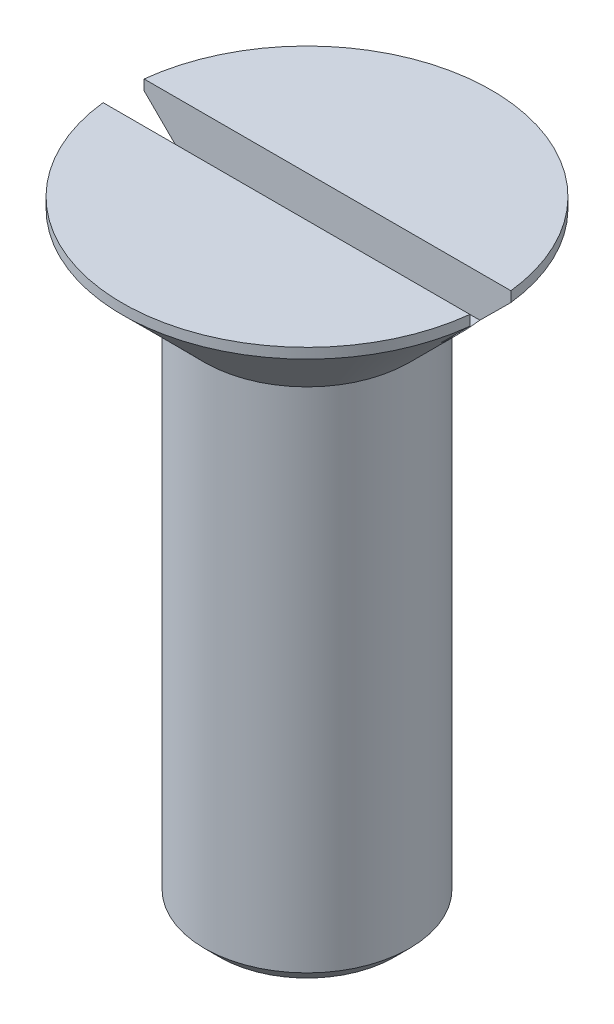
ISO-10303-21;
HEADER;
FILE_DESCRIPTION(('STEP AP214'),'2;1');
FILE_NAME('part.step','',(''),(''),'','','');
FILE_SCHEMA(('AUTOMOTIVE_DESIGN { 1 0 10303 214 1 1 1 1 }'));
ENDSEC;
DATA;
#1=APPLICATION_CONTEXT('core data for automotive mechanical design processes');
#2=APPLICATION_PROTOCOL_DEFINITION('international standard','automotive_design',2000,#1);
#3=PRODUCT_CONTEXT('',#1,'mechanical');
#4=PRODUCT('Part','Part','',(#3));
#5=PRODUCT_RELATED_PRODUCT_CATEGORY('part','',(#4));
#6=PRODUCT_DEFINITION_FORMATION('','',#4);
#7=PRODUCT_DEFINITION_CONTEXT('part definition',#1,'design');
#8=PRODUCT_DEFINITION('design','',#6,#7);
#9=PRODUCT_DEFINITION_SHAPE('','',#8);
#10=(LENGTH_UNIT() NAMED_UNIT(*) SI_UNIT(.MILLI.,.METRE.));
#11=(NAMED_UNIT(*) PLANE_ANGLE_UNIT() SI_UNIT($,.RADIAN.));
#12=(NAMED_UNIT(*) SI_UNIT($,.STERADIAN.) SOLID_ANGLE_UNIT());
#13=UNCERTAINTY_MEASURE_WITH_UNIT(LENGTH_MEASURE(1.E-05),#10,'distance_accuracy_value','');
#14=(GEOMETRIC_REPRESENTATION_CONTEXT(3) GLOBAL_UNCERTAINTY_ASSIGNED_CONTEXT((#13)) GLOBAL_UNIT_ASSIGNED_CONTEXT((#10,
#11,#12)) REPRESENTATION_CONTEXT('',''));
#15=CARTESIAN_POINT('',(0.,0.,0.));
#16=DIRECTION('',(0.,0.,1.));
#17=DIRECTION('',(1.,0.,0.));
#18=AXIS2_PLACEMENT_3D('',#15,#16,#17);
#19=CARTESIAN_POINT('',(0.,125.763182897862,0.));
#20=DIRECTION('',(0.,1.,0.));
#21=DIRECTION('',(-1.,0.,0.));
#22=AXIS2_PLACEMENT_3D('',#19,#20,#21);
#23=CYLINDRICAL_SURFACE('',#22,9.00000000000001);
#24=CARTESIAN_POINT('',(0.,29.5,0.));
#25=DIRECTION('',(0.,1.,0.));
#26=DIRECTION('',(-1.,0.,0.));
#27=AXIS2_PLACEMENT_3D('',#24,#25,#26);
#28=CIRCLE('',#27,9.00000000000001);
#29=CARTESIAN_POINT('',(8.94427190999917,29.5,-1.));
#30=VERTEX_POINT('',#29);
#31=CARTESIAN_POINT('',(-8.94427190999917,29.5,-0.999999999999999));
#32=VERTEX_POINT('',#31);
#33=EDGE_CURVE('E101',#30,#32,#28,.T.);
#34=ORIENTED_EDGE('',*,*,#33,.T.);
#35=DIRECTION('',(0.,1.,0.));
#36=VECTOR('',#35,1.);
#37=CARTESIAN_POINT('',(-8.94427190999918,125.763182897862,-0.999999999999999));
#38=LINE('',#37,#36);
#39=CARTESIAN_POINT('',(-8.94427190999917,30.,-0.999999999999999));
#40=VERTEX_POINT('',#39);
#41=EDGE_CURVE('E52',#32,#40,#38,.T.);
#42=ORIENTED_EDGE('',*,*,#41,.T.);
#43=CARTESIAN_POINT('',(0.,30.,0.));
#44=DIRECTION('',(0.,1.,0.));
#45=DIRECTION('',(-1.,0.,0.));
#46=AXIS2_PLACEMENT_3D('',#43,#44,#45);
#47=CIRCLE('',#46,9.00000000000001);
#48=CARTESIAN_POINT('',(8.94427190999917,30.,-1.));
#49=VERTEX_POINT('',#48);
#50=EDGE_CURVE('E102',#49,#40,#47,.T.);
#51=ORIENTED_EDGE('',*,*,#50,.F.);
#52=DIRECTION('',(0.,1.,0.));
#53=VECTOR('',#52,1.);
#54=CARTESIAN_POINT('',(8.94427190999916,125.763182897862,-1.));
#55=LINE('',#54,#53);
#56=EDGE_CURVE('E138',#49,#30,#55,.F.);
#57=ORIENTED_EDGE('',*,*,#56,.T.);
#58=EDGE_LOOP('',(#34,#42,#51,#57));
#59=FACE_BOUND('',#58,.T.);
#60=ADVANCED_FACE('F29',(#59),#23,.T.);
#61=CARTESIAN_POINT('',(0.,30.,0.));
#62=DIRECTION('',(0.,-1.,0.));
#63=DIRECTION('',(1.,0.,0.));
#64=AXIS2_PLACEMENT_3D('',#61,#62,#63);
#65=PLANE('',#64);
#66=ORIENTED_EDGE('',*,*,#50,.T.);
#67=DIRECTION('',(1.,0.,0.));
#68=VECTOR('',#67,1.);
#69=CARTESIAN_POINT('',(0.,30.,-1.));
#70=LINE('',#69,#68);
#71=EDGE_CURVE('E88',#40,#49,#70,.T.);
#72=ORIENTED_EDGE('',*,*,#71,.T.);
#73=EDGE_LOOP('',(#66,#72));
#74=FACE_BOUND('',#73,.T.);
#75=ADVANCED_FACE('F149',(#74),#65,.F.);
#76=CARTESIAN_POINT('',(5.,0.,0.));
#77=DIRECTION('',(0.,1.,0.));
#78=DIRECTION('',(-1.,0.,0.));
#79=AXIS2_PLACEMENT_3D('',#76,#77,#78);
#80=PLANE('',#79);
#81=CARTESIAN_POINT('',(0.,0.,0.));
#82=DIRECTION('',(0.,1.,0.));
#83=DIRECTION('',(-1.,0.,0.));
#84=AXIS2_PLACEMENT_3D('',#81,#82,#83);
#85=CIRCLE('',#84,4.25);
#86=CARTESIAN_POINT('',(-4.25,0.,0.));
#87=VERTEX_POINT('',#86);
#88=EDGE_CURVE('E11',#87,#87,#85,.F.);
#89=ORIENTED_EDGE('',*,*,#88,.T.);
#90=EDGE_LOOP('',(#89));
#91=FACE_BOUND('',#90,.T.);
#92=ADVANCED_FACE('F31',(#91),#80,.F.);
#93=CARTESIAN_POINT('',(0.,125.763182897862,0.));
#94=DIRECTION('',(0.,1.,0.));
#95=DIRECTION('',(-1.,0.,0.));
#96=AXIS2_PLACEMENT_3D('',#93,#94,#95);
#97=CYLINDRICAL_SURFACE('',#96,5.);
#98=CARTESIAN_POINT('',(0.,0.750000000000001,0.));
#99=DIRECTION('',(0.,1.,0.));
#100=DIRECTION('',(-1.,0.,0.));
#101=AXIS2_PLACEMENT_3D('',#98,#99,#100);
#102=CIRCLE('',#101,5.);
#103=CARTESIAN_POINT('',(-5.,0.75,0.));
#104=VERTEX_POINT('',#103);
#105=EDGE_CURVE('E37',#104,#104,#102,.T.);
#106=ORIENTED_EDGE('',*,*,#105,.T.);
#107=EDGE_LOOP('',(#106));
#108=FACE_BOUND('',#107,.T.);
#109=CARTESIAN_POINT('',(0.,25.5,0.));
#110=DIRECTION('',(0.,1.,0.));
#111=DIRECTION('',(-1.,0.,0.));
#112=AXIS2_PLACEMENT_3D('',#109,#110,#111);
#113=CIRCLE('',#112,5.);
#114=CARTESIAN_POINT('',(-5.,25.5,0.));
#115=VERTEX_POINT('',#114);
#116=EDGE_CURVE('E89',#115,#115,#113,.T.);
#117=ORIENTED_EDGE('',*,*,#116,.F.);
#118=EDGE_LOOP('',(#117));
#119=FACE_BOUND('',#118,.T.);
#120=ADVANCED_FACE('F157',(#108,#119),#97,.T.);
#121=CARTESIAN_POINT('',(0.,25.5,0.));
#122=DIRECTION('',(0.,1.,0.));
#123=DIRECTION('',(-1.,0.,0.));
#124=AXIS2_PLACEMENT_3D('',#121,#122,#123);
#125=CONICAL_SURFACE('',#124,5.,0.785398163397446);
#126=ORIENTED_EDGE('',*,*,#33,.F.);
#127=CARTESIAN_POINT('',(19.8124144714995,40.3376351209131,-1.));
#128=CARTESIAN_POINT('',(19.1349729516754,39.6610614834119,-1.));
#129=CARTESIAN_POINT('',(18.4574935935614,38.9845257183622,-1.));
#130=CARTESIAN_POINT('',(17.1024066040158,37.631573198561,-1.));
#131=CARTESIAN_POINT('',(16.4247989717209,36.9551564446743,-1.));
#132=CARTESIAN_POINT('',(15.069304299387,35.6023868825887,-1.));
#133=CARTESIAN_POINT('',(14.3914172320292,34.9260341017608,-1.));
#134=CARTESIAN_POINT('',(13.0353868675306,33.5735946796389,-1.));
#135=CARTESIAN_POINT('',(12.3572435721668,32.8975080365633,-1.));
#136=CARTESIAN_POINT('',(10.985143917587,31.5304036994092,-1.));
#137=CARTESIAN_POINT('',(10.2911780916219,30.8393955030989,-1.));
#138=CARTESIAN_POINT('',(9.24963486756812,29.8034660874203,-1.));
#139=CARTESIAN_POINT('',(8.90235102088056,29.4582497657146,-1.));
#140=CARTESIAN_POINT('',(8.20750371498185,28.7681000821881,-1.));
#141=CARTESIAN_POINT('',(7.85994025636627,28.4231667197678,-1.));
#142=CARTESIAN_POINT('',(7.16444042834031,27.733746388185,-1.));
#143=CARTESIAN_POINT('',(6.81650410024032,27.3892593773697,-1.));
#144=CARTESIAN_POINT('',(6.11999276041191,26.7009259164057,-1.));
#145=CARTESIAN_POINT('',(5.77141774351009,26.3570794714915,-1.));
#146=CARTESIAN_POINT('',(5.0732382585851,25.6704571442995,-1.));
#147=CARTESIAN_POINT('',(4.72363382946463,25.3276812225492,-1.));
#148=CARTESIAN_POINT('',(4.19774517198558,24.8150415216416,-1.));
#149=CARTESIAN_POINT('',(4.02220311277717,24.6444167715463,-1.));
#150=CARTESIAN_POINT('',(3.67039260166427,24.3039182003748,-1.));
#151=CARTESIAN_POINT('',(3.49412415327468,24.1340443756733,-1.));
#152=CARTESIAN_POINT('',(3.22161277459572,23.873134512313,-1.));
#153=CARTESIAN_POINT('',(3.12576188876751,23.7816891860623,-1.));
#154=CARTESIAN_POINT('',(2.93363547492808,23.5992430661678,-1.));
#155=CARTESIAN_POINT('',(2.83735994162399,23.5082422780947,-1.));
#156=CARTESIAN_POINT('',(2.64447269816499,23.327037416039,-1.));
#157=CARTESIAN_POINT('',(2.54786225099771,23.2368320005677,-1.));
#158=CARTESIAN_POINT('',(2.35389076812001,23.0572385182939,-1.));
#159=CARTESIAN_POINT('',(2.25652975557552,22.9678504264498,-1.));
#160=CARTESIAN_POINT('',(2.02762901073133,22.7601289087949,-1.));
#161=CARTESIAN_POINT('',(1.8956790561691,22.6422431887722,-1.));
#162=CARTESIAN_POINT('',(1.6951334151939,22.4678430509808,-1.));
#163=CARTESIAN_POINT('',(1.62770133404544,22.4099935510382,-1.));
#164=CARTESIAN_POINT('',(1.4917885791332,22.2955721713161,-1.));
#165=CARTESIAN_POINT('',(1.423308187047,22.238999958105,-1.));
#166=CARTESIAN_POINT('',(1.28433527313646,22.1272045692872,-1.));
#167=CARTESIAN_POINT('',(1.21383101303043,22.0719958657637,-1.));
#168=CARTESIAN_POINT('',(1.07065714451159,21.9642660011688,-1.));
#169=CARTESIAN_POINT('',(0.997985095493355,21.9117480652531,-1.));
#170=CARTESIAN_POINT('',(0.850007942626699,21.8113161046107,-1.));
#171=CARTESIAN_POINT('',(0.774719111653368,21.7633788266947,-1.));
#172=CARTESIAN_POINT('',(0.658687578671127,21.6970299635003,-1.));
#173=CARTESIAN_POINT('',(0.619532797587121,21.675857387529,-1.));
#174=CARTESIAN_POINT('',(0.540000904570515,21.6359640610322,-1.));
#175=CARTESIAN_POINT('',(0.499624503076189,21.6172419179517,-1.));
#176=CARTESIAN_POINT('',(0.427823959069766,21.5873150901116,-1.));
#177=CARTESIAN_POINT('',(0.39669630149007,21.5754029952126,-1.));
#178=CARTESIAN_POINT('',(0.333672442915324,21.5537842916062,-1.));
#179=CARTESIAN_POINT('',(0.301776208229588,21.5440777797761,-1.));
#180=CARTESIAN_POINT('',(0.237430250302155,21.5273332310037,-1.));
#181=CARTESIAN_POINT('',(0.204983573891813,21.5202836593659,-1.));
#182=CARTESIAN_POINT('',(0.139583784664544,21.5091809655713,-1.));
#183=CARTESIAN_POINT('',(0.106630841993266,21.5051268582549,-1.));
#184=CARTESIAN_POINT('',(0.0401283564753252,21.5002504584892,-1.));
#185=CARTESIAN_POINT('',(0.00657619341282787,21.4994629161769,-1.));
#186=CARTESIAN_POINT('',(-0.0604292441682666,21.5012619902118,-1.));
#187=CARTESIAN_POINT('',(-0.0938825184000189,21.5038486163369,-1.));
#188=CARTESIAN_POINT('',(-0.193799525506269,21.516470696897,-1.));
#189=CARTESIAN_POINT('',(-0.259675945121679,21.531377967118,-1.));
#190=CARTESIAN_POINT('',(-0.371656043766157,21.5658479584678,-1.));
#191=CARTESIAN_POINT('',(-0.418490689284943,21.5832300065054,-1.));
#192=CARTESIAN_POINT('',(-0.510501618548898,21.6219971281776,-1.));
#193=CARTESIAN_POINT('',(-0.555676634308252,21.6433851894036,-1.));
#194=CARTESIAN_POINT('',(-0.644699735770598,21.689189218606,-1.));
#195=CARTESIAN_POINT('',(-0.688540708000899,21.7136187495253,-1.));
#196=CARTESIAN_POINT('',(-0.77491683618726,21.7646282077589,-1.));
#197=CARTESIAN_POINT('',(-0.817452519805982,21.7912072499064,-1.));
#198=CARTESIAN_POINT('',(-0.909414044142696,21.8511460297917,-1.));
#199=CARTESIAN_POINT('',(-0.958622134302459,21.8848376852683,-1.));
#200=CARTESIAN_POINT('',(-1.05587867438095,21.9538615784682,-1.));
#201=CARTESIAN_POINT('',(-1.10392689237424,21.9891941402407,-1.));
#202=CARTESIAN_POINT('',(-1.24678017114174,22.0970347259457,-1.));
#203=CARTESIAN_POINT('',(-1.34022479951778,22.1713387718107,-1.));
#204=CARTESIAN_POINT('',(-1.52503777193632,22.3229036047889,-1.));
#205=CARTESIAN_POINT('',(-1.61640036020279,22.4001713000708,-1.));
#206=CARTESIAN_POINT('',(-1.79753828385604,22.5564657899158,-1.));
#207=CARTESIAN_POINT('',(-1.88731426234698,22.6354918409896,-1.));
#208=CARTESIAN_POINT('',(-2.06598022298073,22.7949186716609,-1.));
#209=CARTESIAN_POINT('',(-2.15486787976838,22.8753220460774,-1.));
#210=CARTESIAN_POINT('',(-2.3318706940067,23.0369913630271,-1.));
#211=CARTESIAN_POINT('',(-2.41998577142609,23.1182573930391,-1.));
#212=CARTESIAN_POINT('',(-2.59549674891237,23.2812856344183,-1.));
#213=CARTESIAN_POINT('',(-2.68289356240745,23.3630468638936,-1.));
#214=CARTESIAN_POINT('',(-2.8572409147172,23.5270371782964,-1.));
#215=CARTESIAN_POINT('',(-2.94419146914327,23.6092662466425,-1.));
#216=CARTESIAN_POINT('',(-3.20293400606787,23.8549749223953,-0.999999999999999));
#217=CARTESIAN_POINT('',(-3.37422687666895,24.0189798852629,-1.));
#218=CARTESIAN_POINT('',(-3.71595388376926,24.3478826230057,-1.));
#219=CARTESIAN_POINT('',(-3.88638801356891,24.5127804048255,-1.));
#220=CARTESIAN_POINT('',(-4.3968378667081,25.0083732186195,-1.));
#221=CARTESIAN_POINT('',(-4.73599002840641,25.3399571626762,-0.999999999999999));
#222=CARTESIAN_POINT('',(-5.41332666904904,26.0045403892973,-0.999999999999999));
#223=CARTESIAN_POINT('',(-5.75151039208567,26.3375404402156,-0.999999999999999));
#224=CARTESIAN_POINT('',(-6.42715913687203,27.0042581116506,-0.999999999999999));
#225=CARTESIAN_POINT('',(-6.76462416996127,27.3379757206761,-0.999999999999999));
#226=CARTESIAN_POINT('',(-7.43803124062905,28.0048071534958,-0.999999999999999));
#227=CARTESIAN_POINT('',(-7.77397471192088,28.3379195303752,-0.999999999999999));
#228=CARTESIAN_POINT('',(-8.4455564620432,29.0044545781573,-0.999999999999999));
#229=CARTESIAN_POINT('',(-8.78119473958354,29.3378772503599,-0.999999999999999));
#230=CARTESIAN_POINT('',(-9.78765861193636,30.3383351713219,-0.999999999999999));
#231=CARTESIAN_POINT('',(-10.4581652665003,31.0056912223,-0.999999999999999));
#232=CARTESIAN_POINT('',(-11.8515886599205,32.3935299764106,-0.999999999999999));
#233=CARTESIAN_POINT('',(-12.5744674023744,33.1140508132192,-0.999999999999999));
#234=CARTESIAN_POINT('',(-14.0199502981759,34.5554646084889,-0.999999999999999));
#235=CARTESIAN_POINT('',(-14.7425544298974,35.2763575886357,-0.999999999999998));
#236=CARTESIAN_POINT('',(-16.1898056510568,36.7205922632081,-0.999999999999998));
#237=CARTESIAN_POINT('',(-16.9144521016114,37.443934597778,-0.999999999999998));
#238=CARTESIAN_POINT('',(-18.3635511341238,38.8907157087538,-0.999999999999998));
#239=CARTESIAN_POINT('',(-19.0880037258611,39.6141544753644,-0.999999999999998));
#240=CARTESIAN_POINT('',(-19.8124144714995,40.3376351209131,-0.999999999999998));
#241=B_SPLINE_CURVE_WITH_KNOTS('',3,(#127,#128,#129,#130,#131,#132,#133,#134,#135,#136,#137,
#138,#139,#140,#141,#142,#143,#144,#145,#146,#147,#148,#149,#150,#151,#152,#153,#154,#155,#156,
#157,#158,#159,#160,#161,#162,#163,#164,#165,#166,#167,#168,#169,#170,#171,#172,#173,#174,#175,
#176,#177,#178,#179,#180,#181,#182,#183,#184,#185,#186,#187,#188,#189,#190,#191,#192,#193,#194,
#195,#196,#197,#198,#199,#200,#201,#202,#203,#204,#205,#206,#207,#208,#209,#210,#211,#212,#213,
#214,#215,#216,#217,#218,#219,#220,#221,#222,#223,#224,#225,#226,#227,#228,#229,#230,#231,#232,
#233,#234,#235,#236,#237,#238,#239,#240),.UNSPECIFIED.,.F.,.F.,(4,2,2,2,2,2,2,2,2,2,2,2,2,2,2,2,
2,2,2,2,2,2,2,2,2,2,2,2,2,2,2,2,2,2,2,2,2,2,2,2,2,2,2,2,2,2,2,2,2,2,2,2,2,2,2,2,4),(0.,
2.87230050175239,5.74462107298178,8.61739940283951,11.4901581634442,14.4281380122464,
15.8971591376409,17.3661771422375,18.8350464415467,20.303927691801,21.7727541260789,
22.5071576592962,23.2415576430097,23.6389817103805,24.0364107453872,24.4329356810643,
24.8294484267498,25.3602235853652,25.6267513834029,25.8932087813822,26.1618048270442,
26.4307156217093,26.6981793935167,26.8316571616974,26.9650587434328,27.0649794958324,
27.1649046362692,27.2643908285437,27.3638442868432,27.464353072288,27.564862148991,
27.7663069808945,27.9159868379384,28.065778770433,28.216264357521,28.3666882872723,
28.5455517192943,28.7244506250565,29.082498488539,29.4414388014365,29.8002301234383,
30.1597943901934,30.5193954741881,30.878430752774,31.237453384485,31.9488894773147,
32.6603311119346,34.0832601723223,35.5070975453111,36.9309122840346,38.3502065510292,
39.7695067902312,42.6075495310259,45.6694663873988,48.7315882573583,51.8032375493109,
54.874679666331),.UNSPECIFIED.);
#242=CARTESIAN_POINT('',(7.43303437365924,28.,-1.));
#243=VERTEX_POINT('',#242);
#244=EDGE_CURVE('E132',#30,#243,#241,.T.);
#245=ORIENTED_EDGE('',*,*,#244,.T.);
#246=CARTESIAN_POINT('',(0.,28.,0.));
#247=DIRECTION('',(0.,1.,0.));
#248=DIRECTION('',(0.,0.,1.));
#249=AXIS2_PLACEMENT_3D('',#246,#247,#248);
#250=CIRCLE('',#249,7.49999999999999);
#251=CARTESIAN_POINT('',(7.43303437365924,28.,0.999999999999999));
#252=VERTEX_POINT('',#251);
#253=EDGE_CURVE('E116',#252,#243,#250,.T.);
#254=ORIENTED_EDGE('',*,*,#253,.F.);
#255=CARTESIAN_POINT('',(-19.8124144714995,40.3376351209131,1.));
#256=CARTESIAN_POINT('',(-19.1349729516754,39.6610614834119,1.));
#257=CARTESIAN_POINT('',(-18.4574935935614,38.9845257183621,1.));
#258=CARTESIAN_POINT('',(-17.1024066040158,37.631573198561,1.));
#259=CARTESIAN_POINT('',(-16.4247989717209,36.9551564446743,1.));
#260=CARTESIAN_POINT('',(-15.069304299387,35.6023868825887,1.));
#261=CARTESIAN_POINT('',(-14.3914172320292,34.9260341017608,1.));
#262=CARTESIAN_POINT('',(-13.0353868675306,33.5735946796389,1.));
#263=CARTESIAN_POINT('',(-12.3572435721668,32.8975080365633,1.));
#264=CARTESIAN_POINT('',(-10.985143917587,31.5304036994092,1.));
#265=CARTESIAN_POINT('',(-10.2911780916219,30.8393955030989,1.));
#266=CARTESIAN_POINT('',(-9.24963486756813,29.8034660874203,1.));
#267=CARTESIAN_POINT('',(-8.90235102088057,29.4582497657146,1.));
#268=CARTESIAN_POINT('',(-8.20750371498185,28.7681000821881,1.));
#269=CARTESIAN_POINT('',(-7.85994025636627,28.4231667197678,1.));
#270=CARTESIAN_POINT('',(-7.16444042834031,27.733746388185,1.));
#271=CARTESIAN_POINT('',(-6.81650410024032,27.3892593773697,1.));
#272=CARTESIAN_POINT('',(-6.11999276041191,26.7009259164057,1.));
#273=CARTESIAN_POINT('',(-5.77141774351009,26.3570794714915,1.));
#274=CARTESIAN_POINT('',(-5.07323825858511,25.6704571442995,1.));
#275=CARTESIAN_POINT('',(-4.72363382946463,25.3276812225492,1.));
#276=CARTESIAN_POINT('',(-4.19774517198559,24.8150415216416,1.));
#277=CARTESIAN_POINT('',(-4.02220311277717,24.6444167715463,1.));
#278=CARTESIAN_POINT('',(-3.67039260166428,24.3039182003748,1.));
#279=CARTESIAN_POINT('',(-3.49412415327468,24.1340443756733,1.));
#280=CARTESIAN_POINT('',(-3.22161277459572,23.873134512313,1.));
#281=CARTESIAN_POINT('',(-3.12576188876752,23.7816891860623,1.));
#282=CARTESIAN_POINT('',(-2.93363547492809,23.5992430661678,1.));
#283=CARTESIAN_POINT('',(-2.83735994162399,23.5082422780947,1.));
#284=CARTESIAN_POINT('',(-2.64447269816499,23.327037416039,1.));
#285=CARTESIAN_POINT('',(-2.54786225099771,23.2368320005677,1.));
#286=CARTESIAN_POINT('',(-2.35389076812001,23.0572385182939,1.));
#287=CARTESIAN_POINT('',(-2.25652975557552,22.9678504264498,1.));
#288=CARTESIAN_POINT('',(-2.02762901073133,22.7601289087949,1.));
#289=CARTESIAN_POINT('',(-1.8956790561691,22.6422431887722,1.));
#290=CARTESIAN_POINT('',(-1.6951334151939,22.4678430509808,1.));
#291=CARTESIAN_POINT('',(-1.62770133404544,22.4099935510382,1.));
#292=CARTESIAN_POINT('',(-1.4917885791332,22.2955721713161,1.));
#293=CARTESIAN_POINT('',(-1.423308187047,22.238999958105,1.));
#294=CARTESIAN_POINT('',(-1.28433527313645,22.1272045692872,1.));
#295=CARTESIAN_POINT('',(-1.21383101303043,22.0719958657637,1.));
#296=CARTESIAN_POINT('',(-1.07065714451159,21.9642660011688,1.));
#297=CARTESIAN_POINT('',(-0.997985095493353,21.9117480652531,1.));
#298=CARTESIAN_POINT('',(-0.850007942626697,21.8113161046107,1.));
#299=CARTESIAN_POINT('',(-0.774719111653364,21.7633788266947,1.));
#300=CARTESIAN_POINT('',(-0.658687578671125,21.6970299635003,1.));
#301=CARTESIAN_POINT('',(-0.61953279758712,21.675857387529,1.));
#302=CARTESIAN_POINT('',(-0.540000904570514,21.6359640610322,1.));
#303=CARTESIAN_POINT('',(-0.499624503076188,21.6172419179516,1.));
#304=CARTESIAN_POINT('',(-0.427823959069764,21.5873150901116,1.));
#305=CARTESIAN_POINT('',(-0.396696301490068,21.5754029952126,1.));
#306=CARTESIAN_POINT('',(-0.33367244291532,21.5537842916062,1.));
#307=CARTESIAN_POINT('',(-0.301776208229582,21.5440777797761,1.));
#308=CARTESIAN_POINT('',(-0.237430250302149,21.5273332310037,1.));
#309=CARTESIAN_POINT('',(-0.204983573891808,21.5202836593659,1.));
#310=CARTESIAN_POINT('',(-0.139583784664541,21.5091809655713,1.));
#311=CARTESIAN_POINT('',(-0.106630841993263,21.5051268582549,1.));
#312=CARTESIAN_POINT('',(-0.0401283564753224,21.5002504584892,1.));
#313=CARTESIAN_POINT('',(-0.00657619341282524,21.4994629161769,1.));
#314=CARTESIAN_POINT('',(0.0604292441682679,21.5012619902118,1.));
#315=CARTESIAN_POINT('',(0.093882518400019,21.5038486163369,1.));
#316=CARTESIAN_POINT('',(0.193799525506269,21.516470696897,1.));
#317=CARTESIAN_POINT('',(0.259675945121679,21.531377967118,1.));
#318=CARTESIAN_POINT('',(0.371656043766158,21.5658479584678,1.));
#319=CARTESIAN_POINT('',(0.418490689284945,21.5832300065054,1.));
#320=CARTESIAN_POINT('',(0.510501618548901,21.6219971281776,1.));
#321=CARTESIAN_POINT('',(0.555676634308254,21.6433851894036,1.));
#322=CARTESIAN_POINT('',(0.6446997357706,21.689189218606,1.));
#323=CARTESIAN_POINT('',(0.688540708000901,21.7136187495253,1.));
#324=CARTESIAN_POINT('',(0.774916836187263,21.7646282077589,1.));
#325=CARTESIAN_POINT('',(0.817452519805986,21.7912072499064,1.));
#326=CARTESIAN_POINT('',(0.909414044142702,21.8511460297917,1.));
#327=CARTESIAN_POINT('',(0.958622134302464,21.8848376852683,1.));
#328=CARTESIAN_POINT('',(1.05587867438095,21.9538615784682,1.));
#329=CARTESIAN_POINT('',(1.10392689237425,21.9891941402407,1.));
#330=CARTESIAN_POINT('',(1.24678017114174,22.0970347259457,1.));
#331=CARTESIAN_POINT('',(1.34022479951779,22.1713387718107,1.));
#332=CARTESIAN_POINT('',(1.52503777193633,22.3229036047889,1.));
#333=CARTESIAN_POINT('',(1.6164003602028,22.4001713000708,1.));
#334=CARTESIAN_POINT('',(1.79753828385605,22.5564657899158,1.));
#335=CARTESIAN_POINT('',(1.88731426234699,22.6354918409896,1.));
#336=CARTESIAN_POINT('',(2.06598022298074,22.7949186716609,1.));
#337=CARTESIAN_POINT('',(2.1548678797684,22.8753220460774,1.));
#338=CARTESIAN_POINT('',(2.33187069400672,23.0369913630271,1.));
#339=CARTESIAN_POINT('',(2.41998577142611,23.1182573930391,1.));
#340=CARTESIAN_POINT('',(2.59549674891239,23.2812856344183,1.));
#341=CARTESIAN_POINT('',(2.68289356240747,23.3630468638936,1.));
#342=CARTESIAN_POINT('',(2.85724091471722,23.5270371782965,1.));
#343=CARTESIAN_POINT('',(2.94419146914329,23.6092662466425,1.));
#344=CARTESIAN_POINT('',(3.20293400606789,23.8549749223953,0.999999999999999));
#345=CARTESIAN_POINT('',(3.37422687666897,24.0189798852629,1.));
#346=CARTESIAN_POINT('',(3.71595388376928,24.3478826230057,1.));
#347=CARTESIAN_POINT('',(3.88638801356894,24.5127804048256,1.));
#348=CARTESIAN_POINT('',(4.39683786670813,25.0083732186195,1.));
#349=CARTESIAN_POINT('',(4.73599002840644,25.3399571626763,0.999999999999999));
#350=CARTESIAN_POINT('',(5.41332666904908,26.0045403892973,0.999999999999999));
#351=CARTESIAN_POINT('',(5.75151039208571,26.3375404402157,0.999999999999999));
#352=CARTESIAN_POINT('',(6.42715913687208,27.0042581116506,0.999999999999999));
#353=CARTESIAN_POINT('',(6.76462416996131,27.3379757206761,0.999999999999999));
#354=CARTESIAN_POINT('',(7.4380312406291,28.0048071534958,0.999999999999999));
#355=CARTESIAN_POINT('',(7.77397471192093,28.3379195303752,0.999999999999999));
#356=CARTESIAN_POINT('',(8.44555646204326,29.0044545781574,0.999999999999999));
#357=CARTESIAN_POINT('',(8.7811947395836,29.33787725036,0.999999999999999));
#358=CARTESIAN_POINT('',(9.78765861193643,30.338335171322,0.999999999999999));
#359=CARTESIAN_POINT('',(10.4581652665003,31.0056912223,0.999999999999999));
#360=CARTESIAN_POINT('',(11.8515886599206,32.3935299764106,0.999999999999999));
#361=CARTESIAN_POINT('',(12.5744674023745,33.1140508132192,0.999999999999999));
#362=CARTESIAN_POINT('',(14.0199502981759,34.555464608489,0.999999999999999));
#363=CARTESIAN_POINT('',(14.7425544298974,35.2763575886357,0.999999999999998));
#364=CARTESIAN_POINT('',(16.1898056510568,36.7205922632081,0.999999999999998));
#365=CARTESIAN_POINT('',(16.9144521016114,37.443934597778,0.999999999999998));
#366=CARTESIAN_POINT('',(18.3635511341238,38.8907157087538,0.999999999999998));
#367=CARTESIAN_POINT('',(19.0880037258611,39.6141544753644,0.999999999999998));
#368=CARTESIAN_POINT('',(19.8124144714995,40.3376351209131,0.999999999999998));
#369=B_SPLINE_CURVE_WITH_KNOTS('',3,(#255,#256,#257,#258,#259,#260,#261,#262,#263,#264,#265,
#266,#267,#268,#269,#270,#271,#272,#273,#274,#275,#276,#277,#278,#279,#280,#281,#282,#283,#284,
#285,#286,#287,#288,#289,#290,#291,#292,#293,#294,#295,#296,#297,#298,#299,#300,#301,#302,#303,
#304,#305,#306,#307,#308,#309,#310,#311,#312,#313,#314,#315,#316,#317,#318,#319,#320,#321,#322,
#323,#324,#325,#326,#327,#328,#329,#330,#331,#332,#333,#334,#335,#336,#337,#338,#339,#340,#341,
#342,#343,#344,#345,#346,#347,#348,#349,#350,#351,#352,#353,#354,#355,#356,#357,#358,#359,#360,
#361,#362,#363,#364,#365,#366,#367,#368),.UNSPECIFIED.,.F.,.F.,(4,2,2,2,2,2,2,2,2,2,2,2,2,2,2,2,
2,2,2,2,2,2,2,2,2,2,2,2,2,2,2,2,2,2,2,2,2,2,2,2,2,2,2,2,2,2,2,2,2,2,2,2,2,2,2,2,4),(0.,
2.87230050175239,5.74462107298179,8.61739940283952,11.4901581634442,14.4281380122464,
15.8971591376409,17.3661771422375,18.8350464415467,20.303927691801,21.7727541260788,
22.5071576592962,23.2415576430097,23.6389817103805,24.0364107453872,24.4329356810643,
24.8294484267498,25.3602235853652,25.6267513834029,25.8932087813822,26.1618048270442,
26.4307156217093,26.6981793935167,26.8316571616974,26.9650587434328,27.0649794958324,
27.1649046362692,27.2643908285437,27.3638442868432,27.464353072288,27.564862148991,
27.7663069808945,27.9159868379384,28.065778770433,28.216264357521,28.3666882872723,
28.5455517192943,28.7244506250565,29.082498488539,29.4414388014365,29.8002301234383,
30.1597943901934,30.5193954741881,30.878430752774,31.237453384485,31.9488894773148,
32.6603311119346,34.0832601723223,35.5070975453112,36.9309122840347,38.3502065510293,
39.7695067902313,42.607549531026,45.6694663873988,48.7315882573583,51.803237549311,
54.8746796663309),.UNSPECIFIED.);
#370=CARTESIAN_POINT('',(8.94427190999917,29.5,0.999999999999999));
#371=VERTEX_POINT('',#370);
#372=EDGE_CURVE('E97',#252,#371,#369,.T.);
#373=ORIENTED_EDGE('',*,*,#372,.T.);
#374=CARTESIAN_POINT('',(-8.94427190999917,29.5,1.));
#375=VERTEX_POINT('',#374);
#376=EDGE_CURVE('E96',#375,#371,#28,.T.);
#377=ORIENTED_EDGE('',*,*,#376,.F.);
#378=CARTESIAN_POINT('',(-7.43303437365924,28.,1.));
#379=VERTEX_POINT('',#378);
#380=EDGE_CURVE('E98',#375,#379,#369,.T.);
#381=ORIENTED_EDGE('',*,*,#380,.T.);
#382=CARTESIAN_POINT('',(-7.43303437365924,28.,-0.999999999999999));
#383=VERTEX_POINT('',#382);
#384=EDGE_CURVE('E115',#383,#379,#250,.T.);
#385=ORIENTED_EDGE('',*,*,#384,.F.);
#386=EDGE_CURVE('E107',#383,#32,#241,.T.);
#387=ORIENTED_EDGE('',*,*,#386,.T.);
#388=EDGE_LOOP('',(#126,#245,#254,#373,#377,#381,#385,#387));
#389=FACE_BOUND('',#388,.T.);
#390=ORIENTED_EDGE('',*,*,#116,.T.);
#391=EDGE_LOOP('',(#390));
#392=FACE_BOUND('',#391,.T.);
#393=ADVANCED_FACE('F136',(#389,#392),#125,.T.);
#394=ORIENTED_EDGE('',*,*,#376,.T.);
#395=DIRECTION('',(0.,1.,0.));
#396=VECTOR('',#395,1.);
#397=CARTESIAN_POINT('',(8.94427190999916,125.763182897862,0.999999999999999));
#398=LINE('',#397,#396);
#399=CARTESIAN_POINT('',(8.94427190999917,30.,0.999999999999999));
#400=VERTEX_POINT('',#399);
#401=EDGE_CURVE('E83',#371,#400,#398,.T.);
#402=ORIENTED_EDGE('',*,*,#401,.T.);
#403=CARTESIAN_POINT('',(-8.94427190999917,30.,1.));
#404=VERTEX_POINT('',#403);
#405=EDGE_CURVE('E94',#404,#400,#47,.T.);
#406=ORIENTED_EDGE('',*,*,#405,.F.);
#407=DIRECTION('',(0.,1.,0.));
#408=VECTOR('',#407,1.);
#409=CARTESIAN_POINT('',(-8.94427190999918,125.763182897862,1.));
#410=LINE('',#409,#408);
#411=EDGE_CURVE('E44',#404,#375,#410,.F.);
#412=ORIENTED_EDGE('',*,*,#411,.T.);
#413=EDGE_LOOP('',(#394,#402,#406,#412));
#414=FACE_BOUND('',#413,.T.);
#415=ADVANCED_FACE('F93',(#414),#23,.T.);
#416=ORIENTED_EDGE('',*,*,#405,.T.);
#417=DIRECTION('',(-1.,0.,0.));
#418=VECTOR('',#417,1.);
#419=CARTESIAN_POINT('',(0.,30.,1.));
#420=LINE('',#419,#418);
#421=EDGE_CURVE('E79',#400,#404,#420,.T.);
#422=ORIENTED_EDGE('',*,*,#421,.T.);
#423=EDGE_LOOP('',(#416,#422));
#424=FACE_BOUND('',#423,.T.);
#425=ADVANCED_FACE('F100',(#424),#65,.F.);
#426=CARTESIAN_POINT('',(-9.5,28.,1.));
#427=DIRECTION('',(0.,1.,0.));
#428=DIRECTION('',(0.,0.,1.));
#429=AXIS2_PLACEMENT_3D('',#426,#427,#428);
#430=PLANE('',#429);
#431=ORIENTED_EDGE('',*,*,#253,.T.);
#432=DIRECTION('',(-1.,0.,0.));
#433=VECTOR('',#432,1.);
#434=CARTESIAN_POINT('',(-9.5,28.,-0.999999999999999));
#435=LINE('',#434,#433);
#436=EDGE_CURVE('E126',#243,#383,#435,.T.);
#437=ORIENTED_EDGE('',*,*,#436,.T.);
#438=ORIENTED_EDGE('',*,*,#384,.T.);
#439=DIRECTION('',(1.,0.,0.));
#440=VECTOR('',#439,1.);
#441=CARTESIAN_POINT('',(-9.5,28.,1.));
#442=LINE('',#441,#440);
#443=EDGE_CURVE('E128',#379,#252,#442,.T.);
#444=ORIENTED_EDGE('',*,*,#443,.T.);
#445=EDGE_LOOP('',(#431,#437,#438,#444));
#446=FACE_BOUND('',#445,.T.);
#447=ADVANCED_FACE('F125',(#446),#430,.T.);
#448=CARTESIAN_POINT('',(-9.5,28.,-0.999999999999999));
#449=DIRECTION('',(0.,0.,-1.));
#450=DIRECTION('',(-1.,0.,0.));
#451=AXIS2_PLACEMENT_3D('',#448,#449,#450);
#452=PLANE('',#451);
#453=ORIENTED_EDGE('',*,*,#436,.F.);
#454=ORIENTED_EDGE('',*,*,#244,.F.);
#455=ORIENTED_EDGE('',*,*,#56,.F.);
#456=ORIENTED_EDGE('',*,*,#71,.F.);
#457=ORIENTED_EDGE('',*,*,#41,.F.);
#458=ORIENTED_EDGE('',*,*,#386,.F.);
#459=EDGE_LOOP('',(#453,#454,#455,#456,#457,#458));
#460=FACE_BOUND('',#459,.T.);
#461=ADVANCED_FACE('F131',(#460),#452,.F.);
#462=CARTESIAN_POINT('',(-9.5,28.,1.));
#463=DIRECTION('',(0.,0.,1.));
#464=DIRECTION('',(1.,0.,0.));
#465=AXIS2_PLACEMENT_3D('',#462,#463,#464);
#466=PLANE('',#465);
#467=ORIENTED_EDGE('',*,*,#443,.F.);
#468=ORIENTED_EDGE('',*,*,#380,.F.);
#469=ORIENTED_EDGE('',*,*,#411,.F.);
#470=ORIENTED_EDGE('',*,*,#421,.F.);
#471=ORIENTED_EDGE('',*,*,#401,.F.);
#472=ORIENTED_EDGE('',*,*,#372,.F.);
#473=EDGE_LOOP('',(#467,#468,#469,#470,#471,#472));
#474=FACE_BOUND('',#473,.T.);
#475=ADVANCED_FACE('F82',(#474),#466,.F.);
#476=CARTESIAN_POINT('',(0.,0.750000000000001,0.));
#477=DIRECTION('',(0.,1.,0.));
#478=DIRECTION('',(-1.,0.,0.));
#479=AXIS2_PLACEMENT_3D('',#476,#477,#478);
#480=CONICAL_SURFACE('',#479,5.,0.78539816339745);
#481=ORIENTED_EDGE('',*,*,#88,.F.);
#482=EDGE_LOOP('',(#481));
#483=FACE_BOUND('',#482,.T.);
#484=ORIENTED_EDGE('',*,*,#105,.F.);
#485=EDGE_LOOP('',(#484));
#486=FACE_BOUND('',#485,.T.);
#487=ADVANCED_FACE('F178',(#483,#486),#480,.T.);
#488=CLOSED_SHELL('',(#60,#75,#92,#120,#393,#415,#425,#447,#461,#475,#487));
#489=MANIFOLD_SOLID_BREP('B2',#488);
#490=ADVANCED_BREP_SHAPE_REPRESENTATION('',(#18,#489),#14);
#491=SHAPE_DEFINITION_REPRESENTATION(#9,#490);
ENDSEC;
END-ISO-10303-21;
